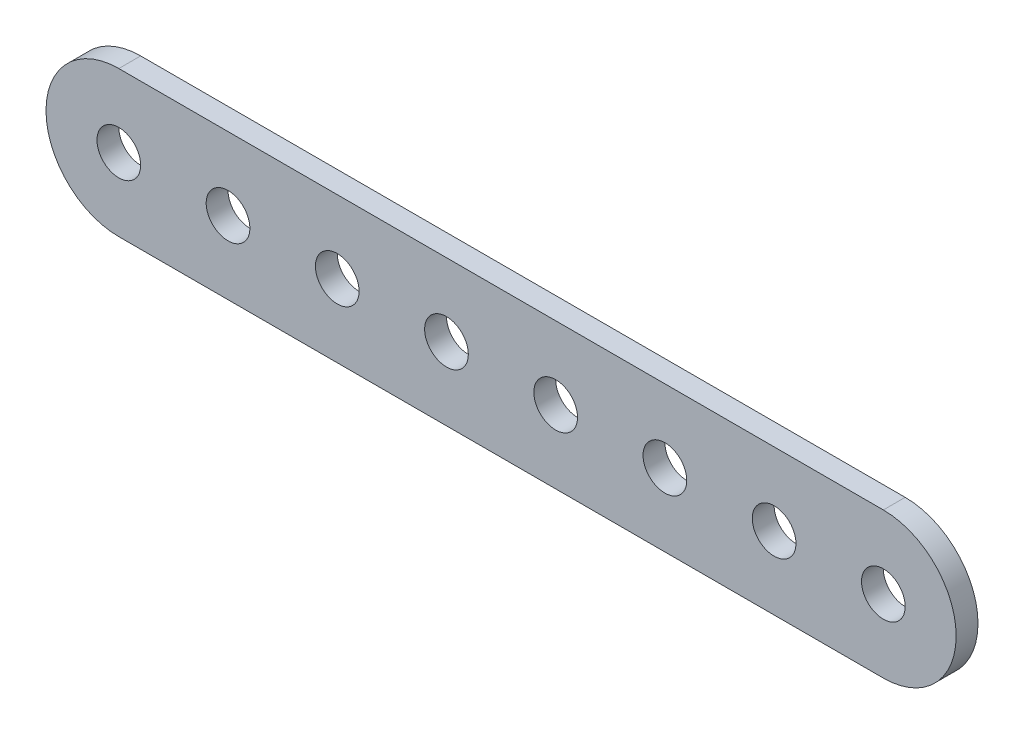
ISO-10303-21;
HEADER;
FILE_DESCRIPTION(('STEP AP214'),'2;1');
FILE_NAME('part.step','',(''),(''),'','','');
FILE_SCHEMA(('AUTOMOTIVE_DESIGN { 1 0 10303 214 1 1 1 1 }'));
ENDSEC;
DATA;
#1=APPLICATION_CONTEXT('core data for automotive mechanical design processes');
#2=APPLICATION_PROTOCOL_DEFINITION('international standard','automotive_design',2000,#1);
#3=PRODUCT_CONTEXT('',#1,'mechanical');
#4=PRODUCT('Part','Part','',(#3));
#5=PRODUCT_RELATED_PRODUCT_CATEGORY('part','',(#4));
#6=PRODUCT_DEFINITION_FORMATION('','',#4);
#7=PRODUCT_DEFINITION_CONTEXT('part definition',#1,'design');
#8=PRODUCT_DEFINITION('design','',#6,#7);
#9=PRODUCT_DEFINITION_SHAPE('','',#8);
#10=(LENGTH_UNIT() NAMED_UNIT(*) SI_UNIT(.MILLI.,.METRE.));
#11=(NAMED_UNIT(*) PLANE_ANGLE_UNIT() SI_UNIT($,.RADIAN.));
#12=(NAMED_UNIT(*) SI_UNIT($,.STERADIAN.) SOLID_ANGLE_UNIT());
#13=UNCERTAINTY_MEASURE_WITH_UNIT(LENGTH_MEASURE(1.E-05),#10,'distance_accuracy_value','');
#14=(GEOMETRIC_REPRESENTATION_CONTEXT(3) GLOBAL_UNCERTAINTY_ASSIGNED_CONTEXT((#13)) GLOBAL_UNIT_ASSIGNED_CONTEXT((#10,
#11,#12)) REPRESENTATION_CONTEXT('',''));
#15=CARTESIAN_POINT('',(0.,0.,0.));
#16=DIRECTION('',(0.,0.,1.));
#17=DIRECTION('',(1.,0.,0.));
#18=AXIS2_PLACEMENT_3D('',#15,#16,#17);
#19=CARTESIAN_POINT('',(-52.5,0.,3.));
#20=DIRECTION('',(0.,0.,1.));
#21=DIRECTION('',(1.,0.,0.));
#22=AXIS2_PLACEMENT_3D('',#19,#20,#21);
#23=PLANE('',#22);
#24=CARTESIAN_POINT('',(22.5,0.,3.));
#25=DIRECTION('',(0.,0.,1.));
#26=DIRECTION('',(-1.,0.,0.));
#27=AXIS2_PLACEMENT_3D('',#24,#25,#26);
#28=CIRCLE('',#27,3.);
#29=CARTESIAN_POINT('',(19.5,0.,3.));
#30=VERTEX_POINT('',#29);
#31=EDGE_CURVE('E149',#30,#30,#28,.T.);
#32=ORIENTED_EDGE('',*,*,#31,.F.);
#33=EDGE_LOOP('',(#32));
#34=FACE_BOUND('',#33,.T.);
#35=CARTESIAN_POINT('',(-22.5,0.,3.));
#36=DIRECTION('',(0.,0.,1.));
#37=DIRECTION('',(1.,0.,0.));
#38=AXIS2_PLACEMENT_3D('',#35,#36,#37);
#39=CIRCLE('',#38,3.);
#40=CARTESIAN_POINT('',(-19.5,0.,3.));
#41=VERTEX_POINT('',#40);
#42=EDGE_CURVE('E137',#41,#41,#39,.T.);
#43=ORIENTED_EDGE('',*,*,#42,.F.);
#44=EDGE_LOOP('',(#43));
#45=FACE_BOUND('',#44,.T.);
#46=CARTESIAN_POINT('',(7.5,0.,3.));
#47=DIRECTION('',(0.,0.,1.));
#48=DIRECTION('',(-1.,0.,0.));
#49=AXIS2_PLACEMENT_3D('',#46,#47,#48);
#50=CIRCLE('',#49,3.);
#51=CARTESIAN_POINT('',(4.5,0.,3.));
#52=VERTEX_POINT('',#51);
#53=EDGE_CURVE('E125',#52,#52,#50,.T.);
#54=ORIENTED_EDGE('',*,*,#53,.F.);
#55=EDGE_LOOP('',(#54));
#56=FACE_BOUND('',#55,.T.);
#57=CARTESIAN_POINT('',(52.5,0.,3.));
#58=DIRECTION('',(0.,0.,1.));
#59=DIRECTION('',(1.,0.,0.));
#60=AXIS2_PLACEMENT_3D('',#57,#58,#59);
#61=CIRCLE('',#60,3.);
#62=CARTESIAN_POINT('',(55.5,0.,3.));
#63=VERTEX_POINT('',#62);
#64=EDGE_CURVE('E104',#63,#63,#61,.T.);
#65=ORIENTED_EDGE('',*,*,#64,.F.);
#66=EDGE_LOOP('',(#65));
#67=FACE_BOUND('',#66,.T.);
#68=CARTESIAN_POINT('',(-52.5,0.,3.));
#69=DIRECTION('',(0.,0.,1.));
#70=DIRECTION('',(1.,0.,0.));
#71=AXIS2_PLACEMENT_3D('',#68,#69,#70);
#72=CIRCLE('',#71,10.);
#73=CARTESIAN_POINT('',(-52.5,10.,3.));
#74=VERTEX_POINT('',#73);
#75=CARTESIAN_POINT('',(-52.5,-10.,3.));
#76=VERTEX_POINT('',#75);
#77=EDGE_CURVE('E89',#74,#76,#72,.T.);
#78=ORIENTED_EDGE('',*,*,#77,.T.);
#79=DIRECTION('',(1.,0.,0.));
#80=VECTOR('',#79,1.);
#81=CARTESIAN_POINT('',(52.5,-10.,3.));
#82=LINE('',#81,#80);
#83=CARTESIAN_POINT('',(52.5,-10.,3.));
#84=VERTEX_POINT('',#83);
#85=EDGE_CURVE('E84',#76,#84,#82,.T.);
#86=ORIENTED_EDGE('',*,*,#85,.T.);
#87=CARTESIAN_POINT('',(52.5,0.,3.));
#88=DIRECTION('',(0.,0.,1.));
#89=DIRECTION('',(-1.,0.,0.));
#90=AXIS2_PLACEMENT_3D('',#87,#88,#89);
#91=CIRCLE('',#90,10.);
#92=CARTESIAN_POINT('',(52.5,10.,3.));
#93=VERTEX_POINT('',#92);
#94=EDGE_CURVE('E87',#84,#93,#91,.T.);
#95=ORIENTED_EDGE('',*,*,#94,.T.);
#96=DIRECTION('',(-1.,0.,0.));
#97=VECTOR('',#96,1.);
#98=CARTESIAN_POINT('',(-52.5,10.,3.));
#99=LINE('',#98,#97);
#100=EDGE_CURVE('E54',#93,#74,#99,.T.);
#101=ORIENTED_EDGE('',*,*,#100,.T.);
#102=EDGE_LOOP('',(#78,#86,#95,#101));
#103=FACE_BOUND('',#102,.T.);
#104=CARTESIAN_POINT('',(-52.5,0.,3.));
#105=DIRECTION('',(0.,0.,1.));
#106=DIRECTION('',(1.,0.,0.));
#107=AXIS2_PLACEMENT_3D('',#104,#105,#106);
#108=CIRCLE('',#107,3.);
#109=CARTESIAN_POINT('',(-49.5,0.,3.));
#110=VERTEX_POINT('',#109);
#111=EDGE_CURVE('E119',#110,#110,#108,.T.);
#112=ORIENTED_EDGE('',*,*,#111,.F.);
#113=EDGE_LOOP('',(#112));
#114=FACE_BOUND('',#113,.T.);
#115=CARTESIAN_POINT('',(-37.5,0.,3.));
#116=DIRECTION('',(0.,0.,1.));
#117=DIRECTION('',(1.,0.,0.));
#118=AXIS2_PLACEMENT_3D('',#115,#116,#117);
#119=CIRCLE('',#118,3.);
#120=CARTESIAN_POINT('',(-34.5,0.,3.));
#121=VERTEX_POINT('',#120);
#122=EDGE_CURVE('E131',#121,#121,#119,.T.);
#123=ORIENTED_EDGE('',*,*,#122,.F.);
#124=EDGE_LOOP('',(#123));
#125=FACE_BOUND('',#124,.T.);
#126=CARTESIAN_POINT('',(-7.5,0.,3.));
#127=DIRECTION('',(0.,0.,1.));
#128=DIRECTION('',(1.,0.,0.));
#129=AXIS2_PLACEMENT_3D('',#126,#127,#128);
#130=CIRCLE('',#129,3.);
#131=CARTESIAN_POINT('',(-4.5,0.,3.));
#132=VERTEX_POINT('',#131);
#133=EDGE_CURVE('E143',#132,#132,#130,.T.);
#134=ORIENTED_EDGE('',*,*,#133,.F.);
#135=EDGE_LOOP('',(#134));
#136=FACE_BOUND('',#135,.T.);
#137=CARTESIAN_POINT('',(37.5,0.,3.));
#138=DIRECTION('',(0.,0.,1.));
#139=DIRECTION('',(-1.,0.,0.));
#140=AXIS2_PLACEMENT_3D('',#137,#138,#139);
#141=CIRCLE('',#140,3.);
#142=CARTESIAN_POINT('',(34.5,0.,3.));
#143=VERTEX_POINT('',#142);
#144=EDGE_CURVE('E155',#143,#143,#141,.T.);
#145=ORIENTED_EDGE('',*,*,#144,.F.);
#146=EDGE_LOOP('',(#145));
#147=FACE_BOUND('',#146,.T.);
#148=ADVANCED_FACE('F37',(#34,#45,#56,#67,#103,#114,#125,#136,#147),#23,.T.);
#149=CARTESIAN_POINT('',(-52.5,0.,0.));
#150=DIRECTION('',(0.,0.,1.));
#151=DIRECTION('',(1.,0.,0.));
#152=AXIS2_PLACEMENT_3D('',#149,#150,#151);
#153=PLANE('',#152);
#154=CARTESIAN_POINT('',(-52.5,0.,0.));
#155=DIRECTION('',(0.,0.,1.));
#156=DIRECTION('',(1.,0.,0.));
#157=AXIS2_PLACEMENT_3D('',#154,#155,#156);
#158=CIRCLE('',#157,10.);
#159=CARTESIAN_POINT('',(-52.5,10.,0.));
#160=VERTEX_POINT('',#159);
#161=CARTESIAN_POINT('',(-52.5,-10.,0.));
#162=VERTEX_POINT('',#161);
#163=EDGE_CURVE('E101',#160,#162,#158,.T.);
#164=ORIENTED_EDGE('',*,*,#163,.F.);
#165=DIRECTION('',(-1.,0.,0.));
#166=VECTOR('',#165,1.);
#167=CARTESIAN_POINT('',(-52.5,10.,0.));
#168=LINE('',#167,#166);
#169=CARTESIAN_POINT('',(52.5,10.,0.));
#170=VERTEX_POINT('',#169);
#171=EDGE_CURVE('E77',#170,#160,#168,.T.);
#172=ORIENTED_EDGE('',*,*,#171,.F.);
#173=CARTESIAN_POINT('',(52.5,0.,0.));
#174=DIRECTION('',(0.,0.,1.));
#175=DIRECTION('',(-1.,0.,0.));
#176=AXIS2_PLACEMENT_3D('',#173,#174,#175);
#177=CIRCLE('',#176,10.);
#178=CARTESIAN_POINT('',(52.5,-10.,0.));
#179=VERTEX_POINT('',#178);
#180=EDGE_CURVE('E71',#179,#170,#177,.T.);
#181=ORIENTED_EDGE('',*,*,#180,.F.);
#182=DIRECTION('',(1.,0.,0.));
#183=VECTOR('',#182,1.);
#184=CARTESIAN_POINT('',(52.5,-10.,0.));
#185=LINE('',#184,#183);
#186=EDGE_CURVE('E93',#162,#179,#185,.T.);
#187=ORIENTED_EDGE('',*,*,#186,.F.);
#188=EDGE_LOOP('',(#164,#172,#181,#187));
#189=FACE_BOUND('',#188,.T.);
#190=CARTESIAN_POINT('',(52.5,0.,0.));
#191=DIRECTION('',(0.,0.,1.));
#192=DIRECTION('',(1.,0.,0.));
#193=AXIS2_PLACEMENT_3D('',#190,#191,#192);
#194=CIRCLE('',#193,3.);
#195=CARTESIAN_POINT('',(55.5,0.,0.));
#196=VERTEX_POINT('',#195);
#197=EDGE_CURVE('E116',#196,#196,#194,.T.);
#198=ORIENTED_EDGE('',*,*,#197,.T.);
#199=EDGE_LOOP('',(#198));
#200=FACE_BOUND('',#199,.T.);
#201=CARTESIAN_POINT('',(-52.5,0.,0.));
#202=DIRECTION('',(0.,0.,1.));
#203=DIRECTION('',(1.,0.,0.));
#204=AXIS2_PLACEMENT_3D('',#201,#202,#203);
#205=CIRCLE('',#204,3.);
#206=CARTESIAN_POINT('',(-49.5,0.,0.));
#207=VERTEX_POINT('',#206);
#208=EDGE_CURVE('E122',#207,#207,#205,.T.);
#209=ORIENTED_EDGE('',*,*,#208,.T.);
#210=EDGE_LOOP('',(#209));
#211=FACE_BOUND('',#210,.T.);
#212=CARTESIAN_POINT('',(7.5,0.,0.));
#213=DIRECTION('',(0.,0.,1.));
#214=DIRECTION('',(-1.,0.,0.));
#215=AXIS2_PLACEMENT_3D('',#212,#213,#214);
#216=CIRCLE('',#215,3.);
#217=CARTESIAN_POINT('',(4.5,0.,0.));
#218=VERTEX_POINT('',#217);
#219=EDGE_CURVE('E128',#218,#218,#216,.T.);
#220=ORIENTED_EDGE('',*,*,#219,.T.);
#221=EDGE_LOOP('',(#220));
#222=FACE_BOUND('',#221,.T.);
#223=CARTESIAN_POINT('',(-37.5,0.,0.));
#224=DIRECTION('',(0.,0.,1.));
#225=DIRECTION('',(1.,0.,0.));
#226=AXIS2_PLACEMENT_3D('',#223,#224,#225);
#227=CIRCLE('',#226,3.);
#228=CARTESIAN_POINT('',(-34.5,0.,0.));
#229=VERTEX_POINT('',#228);
#230=EDGE_CURVE('E134',#229,#229,#227,.T.);
#231=ORIENTED_EDGE('',*,*,#230,.T.);
#232=EDGE_LOOP('',(#231));
#233=FACE_BOUND('',#232,.T.);
#234=CARTESIAN_POINT('',(-22.5,0.,0.));
#235=DIRECTION('',(0.,0.,1.));
#236=DIRECTION('',(1.,0.,0.));
#237=AXIS2_PLACEMENT_3D('',#234,#235,#236);
#238=CIRCLE('',#237,3.);
#239=CARTESIAN_POINT('',(-19.5,0.,0.));
#240=VERTEX_POINT('',#239);
#241=EDGE_CURVE('E140',#240,#240,#238,.T.);
#242=ORIENTED_EDGE('',*,*,#241,.T.);
#243=EDGE_LOOP('',(#242));
#244=FACE_BOUND('',#243,.T.);
#245=CARTESIAN_POINT('',(-7.5,0.,0.));
#246=DIRECTION('',(0.,0.,1.));
#247=DIRECTION('',(1.,0.,0.));
#248=AXIS2_PLACEMENT_3D('',#245,#246,#247);
#249=CIRCLE('',#248,3.);
#250=CARTESIAN_POINT('',(-4.5,0.,0.));
#251=VERTEX_POINT('',#250);
#252=EDGE_CURVE('E146',#251,#251,#249,.T.);
#253=ORIENTED_EDGE('',*,*,#252,.T.);
#254=EDGE_LOOP('',(#253));
#255=FACE_BOUND('',#254,.T.);
#256=CARTESIAN_POINT('',(22.5,0.,0.));
#257=DIRECTION('',(0.,0.,1.));
#258=DIRECTION('',(-1.,0.,0.));
#259=AXIS2_PLACEMENT_3D('',#256,#257,#258);
#260=CIRCLE('',#259,3.);
#261=CARTESIAN_POINT('',(19.5,0.,0.));
#262=VERTEX_POINT('',#261);
#263=EDGE_CURVE('E152',#262,#262,#260,.T.);
#264=ORIENTED_EDGE('',*,*,#263,.T.);
#265=EDGE_LOOP('',(#264));
#266=FACE_BOUND('',#265,.T.);
#267=CARTESIAN_POINT('',(37.5,0.,0.));
#268=DIRECTION('',(0.,0.,1.));
#269=DIRECTION('',(-1.,0.,0.));
#270=AXIS2_PLACEMENT_3D('',#267,#268,#269);
#271=CIRCLE('',#270,3.);
#272=CARTESIAN_POINT('',(34.5,0.,0.));
#273=VERTEX_POINT('',#272);
#274=EDGE_CURVE('E158',#273,#273,#271,.T.);
#275=ORIENTED_EDGE('',*,*,#274,.T.);
#276=EDGE_LOOP('',(#275));
#277=FACE_BOUND('',#276,.T.);
#278=ADVANCED_FACE('F112',(#189,#200,#211,#222,#233,#244,#255,#266,#277),#153,.F.);
#279=CARTESIAN_POINT('',(-52.5,0.,3.));
#280=DIRECTION('',(0.,0.,-1.));
#281=DIRECTION('',(-1.,0.,0.));
#282=AXIS2_PLACEMENT_3D('',#279,#280,#281);
#283=CYLINDRICAL_SURFACE('',#282,10.);
#284=ORIENTED_EDGE('',*,*,#163,.T.);
#285=DIRECTION('',(0.,0.,-1.));
#286=VECTOR('',#285,1.);
#287=CARTESIAN_POINT('',(-52.5,-10.,3.));
#288=LINE('',#287,#286);
#289=EDGE_CURVE('E11',#76,#162,#288,.T.);
#290=ORIENTED_EDGE('',*,*,#289,.F.);
#291=ORIENTED_EDGE('',*,*,#77,.F.);
#292=DIRECTION('',(0.,0.,-1.));
#293=VECTOR('',#292,1.);
#294=CARTESIAN_POINT('',(-52.5,10.,3.));
#295=LINE('',#294,#293);
#296=EDGE_CURVE('E97',#74,#160,#295,.T.);
#297=ORIENTED_EDGE('',*,*,#296,.T.);
#298=EDGE_LOOP('',(#284,#290,#291,#297));
#299=FACE_BOUND('',#298,.T.);
#300=ADVANCED_FACE('F39',(#299),#283,.T.);
#301=CARTESIAN_POINT('',(52.5,-10.,3.));
#302=DIRECTION('',(0.,1.,0.));
#303=DIRECTION('',(-1.,0.,0.));
#304=AXIS2_PLACEMENT_3D('',#301,#302,#303);
#305=PLANE('',#304);
#306=ORIENTED_EDGE('',*,*,#186,.T.);
#307=DIRECTION('',(0.,0.,-1.));
#308=VECTOR('',#307,1.);
#309=CARTESIAN_POINT('',(52.5,-10.,3.));
#310=LINE('',#309,#308);
#311=EDGE_CURVE('E46',#84,#179,#310,.T.);
#312=ORIENTED_EDGE('',*,*,#311,.F.);
#313=ORIENTED_EDGE('',*,*,#85,.F.);
#314=ORIENTED_EDGE('',*,*,#289,.T.);
#315=EDGE_LOOP('',(#306,#312,#313,#314));
#316=FACE_BOUND('',#315,.T.);
#317=ADVANCED_FACE('F92',(#316),#305,.F.);
#318=CARTESIAN_POINT('',(52.5,0.,3.));
#319=DIRECTION('',(0.,0.,-1.));
#320=DIRECTION('',(-1.,0.,0.));
#321=AXIS2_PLACEMENT_3D('',#318,#319,#320);
#322=CYLINDRICAL_SURFACE('',#321,10.);
#323=ORIENTED_EDGE('',*,*,#180,.T.);
#324=DIRECTION('',(0.,0.,-1.));
#325=VECTOR('',#324,1.);
#326=CARTESIAN_POINT('',(52.5,10.,3.));
#327=LINE('',#326,#325);
#328=EDGE_CURVE('E94',#93,#170,#327,.T.);
#329=ORIENTED_EDGE('',*,*,#328,.F.);
#330=ORIENTED_EDGE('',*,*,#94,.F.);
#331=ORIENTED_EDGE('',*,*,#311,.T.);
#332=EDGE_LOOP('',(#323,#329,#330,#331));
#333=FACE_BOUND('',#332,.T.);
#334=ADVANCED_FACE('F95',(#333),#322,.T.);
#335=CARTESIAN_POINT('',(-52.5,10.,3.));
#336=DIRECTION('',(0.,-1.,0.));
#337=DIRECTION('',(1.,0.,0.));
#338=AXIS2_PLACEMENT_3D('',#335,#336,#337);
#339=PLANE('',#338);
#340=ORIENTED_EDGE('',*,*,#171,.T.);
#341=ORIENTED_EDGE('',*,*,#296,.F.);
#342=ORIENTED_EDGE('',*,*,#100,.F.);
#343=ORIENTED_EDGE('',*,*,#328,.T.);
#344=EDGE_LOOP('',(#340,#341,#342,#343));
#345=FACE_BOUND('',#344,.T.);
#346=ADVANCED_FACE('F109',(#345),#339,.F.);
#347=CARTESIAN_POINT('',(52.5,0.,3.));
#348=DIRECTION('',(0.,0.,-1.));
#349=DIRECTION('',(-1.,0.,0.));
#350=AXIS2_PLACEMENT_3D('',#347,#348,#349);
#351=CYLINDRICAL_SURFACE('',#350,3.);
#352=ORIENTED_EDGE('',*,*,#64,.T.);
#353=EDGE_LOOP('',(#352));
#354=FACE_BOUND('',#353,.T.);
#355=ORIENTED_EDGE('',*,*,#197,.F.);
#356=EDGE_LOOP('',(#355));
#357=FACE_BOUND('',#356,.T.);
#358=ADVANCED_FACE('F177',(#354,#357),#351,.F.);
#359=CARTESIAN_POINT('',(-52.5,0.,3.));
#360=DIRECTION('',(0.,0.,-1.));
#361=DIRECTION('',(-1.,0.,0.));
#362=AXIS2_PLACEMENT_3D('',#359,#360,#361);
#363=CYLINDRICAL_SURFACE('',#362,3.);
#364=ORIENTED_EDGE('',*,*,#111,.T.);
#365=EDGE_LOOP('',(#364));
#366=FACE_BOUND('',#365,.T.);
#367=ORIENTED_EDGE('',*,*,#208,.F.);
#368=EDGE_LOOP('',(#367));
#369=FACE_BOUND('',#368,.T.);
#370=ADVANCED_FACE('F231',(#366,#369),#363,.F.);
#371=CARTESIAN_POINT('',(7.5,0.,3.));
#372=DIRECTION('',(0.,0.,-1.));
#373=DIRECTION('',(-1.,0.,0.));
#374=AXIS2_PLACEMENT_3D('',#371,#372,#373);
#375=CYLINDRICAL_SURFACE('',#374,3.);
#376=ORIENTED_EDGE('',*,*,#53,.T.);
#377=EDGE_LOOP('',(#376));
#378=FACE_BOUND('',#377,.T.);
#379=ORIENTED_EDGE('',*,*,#219,.F.);
#380=EDGE_LOOP('',(#379));
#381=FACE_BOUND('',#380,.T.);
#382=ADVANCED_FACE('F240',(#378,#381),#375,.F.);
#383=CARTESIAN_POINT('',(-37.5,0.,3.));
#384=DIRECTION('',(0.,0.,-1.));
#385=DIRECTION('',(-1.,0.,0.));
#386=AXIS2_PLACEMENT_3D('',#383,#384,#385);
#387=CYLINDRICAL_SURFACE('',#386,3.);
#388=ORIENTED_EDGE('',*,*,#122,.T.);
#389=EDGE_LOOP('',(#388));
#390=FACE_BOUND('',#389,.T.);
#391=ORIENTED_EDGE('',*,*,#230,.F.);
#392=EDGE_LOOP('',(#391));
#393=FACE_BOUND('',#392,.T.);
#394=ADVANCED_FACE('F249',(#390,#393),#387,.F.);
#395=CARTESIAN_POINT('',(-22.5,0.,3.));
#396=DIRECTION('',(0.,0.,-1.));
#397=DIRECTION('',(-1.,0.,0.));
#398=AXIS2_PLACEMENT_3D('',#395,#396,#397);
#399=CYLINDRICAL_SURFACE('',#398,3.);
#400=ORIENTED_EDGE('',*,*,#42,.T.);
#401=EDGE_LOOP('',(#400));
#402=FACE_BOUND('',#401,.T.);
#403=ORIENTED_EDGE('',*,*,#241,.F.);
#404=EDGE_LOOP('',(#403));
#405=FACE_BOUND('',#404,.T.);
#406=ADVANCED_FACE('F259',(#402,#405),#399,.F.);
#407=CARTESIAN_POINT('',(-7.5,0.,3.));
#408=DIRECTION('',(0.,0.,-1.));
#409=DIRECTION('',(-1.,0.,0.));
#410=AXIS2_PLACEMENT_3D('',#407,#408,#409);
#411=CYLINDRICAL_SURFACE('',#410,3.);
#412=ORIENTED_EDGE('',*,*,#133,.T.);
#413=EDGE_LOOP('',(#412));
#414=FACE_BOUND('',#413,.T.);
#415=ORIENTED_EDGE('',*,*,#252,.F.);
#416=EDGE_LOOP('',(#415));
#417=FACE_BOUND('',#416,.T.);
#418=ADVANCED_FACE('F269',(#414,#417),#411,.F.);
#419=CARTESIAN_POINT('',(22.5,0.,3.));
#420=DIRECTION('',(0.,0.,-1.));
#421=DIRECTION('',(-1.,0.,0.));
#422=AXIS2_PLACEMENT_3D('',#419,#420,#421);
#423=CYLINDRICAL_SURFACE('',#422,3.);
#424=ORIENTED_EDGE('',*,*,#31,.T.);
#425=EDGE_LOOP('',(#424));
#426=FACE_BOUND('',#425,.T.);
#427=ORIENTED_EDGE('',*,*,#263,.F.);
#428=EDGE_LOOP('',(#427));
#429=FACE_BOUND('',#428,.T.);
#430=ADVANCED_FACE('F279',(#426,#429),#423,.F.);
#431=CARTESIAN_POINT('',(37.5,0.,3.));
#432=DIRECTION('',(0.,0.,-1.));
#433=DIRECTION('',(-1.,0.,0.));
#434=AXIS2_PLACEMENT_3D('',#431,#432,#433);
#435=CYLINDRICAL_SURFACE('',#434,3.);
#436=ORIENTED_EDGE('',*,*,#144,.T.);
#437=EDGE_LOOP('',(#436));
#438=FACE_BOUND('',#437,.T.);
#439=ORIENTED_EDGE('',*,*,#274,.F.);
#440=EDGE_LOOP('',(#439));
#441=FACE_BOUND('',#440,.T.);
#442=ADVANCED_FACE('F164',(#438,#441),#435,.F.);
#443=CLOSED_SHELL('',(#148,#278,#300,#317,#334,#346,#358,#370,#382,#394,#406,#418,#430,#442));
#444=MANIFOLD_SOLID_BREP('B2',#443);
#445=ADVANCED_BREP_SHAPE_REPRESENTATION('',(#18,#444),#14);
#446=SHAPE_DEFINITION_REPRESENTATION(#9,#445);
ENDSEC;
END-ISO-10303-21;
